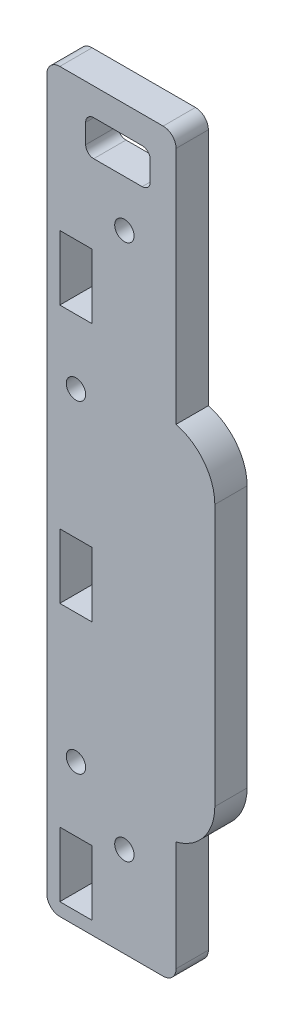
ISO-10303-21;
HEADER;
FILE_DESCRIPTION(('STEP AP214'),'2;1');
FILE_NAME('part.step','',(''),(''),'','','');
FILE_SCHEMA(('AUTOMOTIVE_DESIGN { 1 0 10303 214 1 1 1 1 }'));
ENDSEC;
DATA;
#1=APPLICATION_CONTEXT('core data for automotive mechanical design processes');
#2=APPLICATION_PROTOCOL_DEFINITION('international standard','automotive_design',2000,#1);
#3=PRODUCT_CONTEXT('',#1,'mechanical');
#4=PRODUCT('Part','Part','',(#3));
#5=PRODUCT_RELATED_PRODUCT_CATEGORY('part','',(#4));
#6=PRODUCT_DEFINITION_FORMATION('','',#4);
#7=PRODUCT_DEFINITION_CONTEXT('part definition',#1,'design');
#8=PRODUCT_DEFINITION('design','',#6,#7);
#9=PRODUCT_DEFINITION_SHAPE('','',#8);
#10=(LENGTH_UNIT() NAMED_UNIT(*) SI_UNIT(.MILLI.,.METRE.));
#11=(NAMED_UNIT(*) PLANE_ANGLE_UNIT() SI_UNIT($,.RADIAN.));
#12=(NAMED_UNIT(*) SI_UNIT($,.STERADIAN.) SOLID_ANGLE_UNIT());
#13=UNCERTAINTY_MEASURE_WITH_UNIT(LENGTH_MEASURE(1.E-05),#10,'distance_accuracy_value','');
#14=(GEOMETRIC_REPRESENTATION_CONTEXT(3) GLOBAL_UNCERTAINTY_ASSIGNED_CONTEXT((#13)) GLOBAL_UNIT_ASSIGNED_CONTEXT((#10,
#11,#12)) REPRESENTATION_CONTEXT('',''));
#15=CARTESIAN_POINT('',(0.,0.,0.));
#16=DIRECTION('',(0.,0.,1.));
#17=DIRECTION('',(1.,0.,0.));
#18=AXIS2_PLACEMENT_3D('',#15,#16,#17);
#19=CARTESIAN_POINT('',(5.25,103.5,5.));
#20=DIRECTION('',(0.,0.,-1.));
#21=DIRECTION('',(-1.,0.,0.));
#22=AXIS2_PLACEMENT_3D('',#19,#20,#21);
#23=CYLINDRICAL_SURFACE('',#22,1.25);
#24=CARTESIAN_POINT('',(5.25,103.5,5.));
#25=DIRECTION('',(0.,0.,1.));
#26=DIRECTION('',(1.,0.,0.));
#27=AXIS2_PLACEMENT_3D('',#24,#25,#26);
#28=CIRCLE('',#27,1.25);
#29=CARTESIAN_POINT('',(4.,103.5,5.));
#30=VERTEX_POINT('',#29);
#31=CARTESIAN_POINT('',(5.25,102.25,5.));
#32=VERTEX_POINT('',#31);
#33=EDGE_CURVE('E255',#30,#32,#28,.T.);
#34=ORIENTED_EDGE('',*,*,#33,.T.);
#35=DIRECTION('',(0.,0.,1.));
#36=VECTOR('',#35,1.);
#37=CARTESIAN_POINT('',(5.25,102.25,0.));
#38=LINE('',#37,#36);
#39=CARTESIAN_POINT('',(5.25,102.25,0.));
#40=VERTEX_POINT('',#39);
#41=EDGE_CURVE('E242',#40,#32,#38,.T.);
#42=ORIENTED_EDGE('',*,*,#41,.F.);
#43=CARTESIAN_POINT('',(5.25,103.5,0.));
#44=DIRECTION('',(0.,0.,1.));
#45=DIRECTION('',(1.,0.,0.));
#46=AXIS2_PLACEMENT_3D('',#43,#44,#45);
#47=CIRCLE('',#46,1.25);
#48=CARTESIAN_POINT('',(4.,103.5,0.));
#49=VERTEX_POINT('',#48);
#50=EDGE_CURVE('E252',#49,#40,#47,.T.);
#51=ORIENTED_EDGE('',*,*,#50,.F.);
#52=DIRECTION('',(0.,0.,-1.));
#53=VECTOR('',#52,1.);
#54=CARTESIAN_POINT('',(4.,103.5,5.));
#55=LINE('',#54,#53);
#56=EDGE_CURVE('E274',#30,#49,#55,.T.);
#57=ORIENTED_EDGE('',*,*,#56,.F.);
#58=EDGE_LOOP('',(#34,#42,#51,#57));
#59=FACE_BOUND('',#58,.T.);
#60=ADVANCED_FACE('F33',(#59),#23,.F.);
#61=CARTESIAN_POINT('',(0.,0.,5.));
#62=DIRECTION('',(0.,0.,-1.));
#63=DIRECTION('',(-1.,0.,0.));
#64=AXIS2_PLACEMENT_3D('',#61,#62,#63);
#65=PLANE('',#64);
#66=CARTESIAN_POINT('',(2.5,70.,5.));
#67=DIRECTION('',(0.,0.,1.));
#68=DIRECTION('',(1.,0.,0.));
#69=AXIS2_PLACEMENT_3D('',#66,#67,#68);
#70=CIRCLE('',#69,1.5);
#71=CARTESIAN_POINT('',(4.,70.,5.));
#72=VERTEX_POINT('',#71);
#73=EDGE_CURVE('E408',#72,#72,#70,.T.);
#74=ORIENTED_EDGE('',*,*,#73,.F.);
#75=EDGE_LOOP('',(#74));
#76=FACE_BOUND('',#75,.T.);
#77=CARTESIAN_POINT('',(2.5,20.,5.));
#78=DIRECTION('',(0.,0.,1.));
#79=DIRECTION('',(1.,0.,0.));
#80=AXIS2_PLACEMENT_3D('',#77,#78,#79);
#81=CIRCLE('',#80,1.5);
#82=CARTESIAN_POINT('',(4.,20.,5.));
#83=VERTEX_POINT('',#82);
#84=EDGE_CURVE('E416',#83,#83,#81,.T.);
#85=ORIENTED_EDGE('',*,*,#84,.F.);
#86=EDGE_LOOP('',(#85));
#87=FACE_BOUND('',#86,.T.);
#88=DIRECTION('',(1.,0.,0.));
#89=VECTOR('',#88,1.);
#90=CARTESIAN_POINT('',(0.,40.,5.));
#91=LINE('',#90,#89);
#92=CARTESIAN_POINT('',(0.,40.,5.));
#93=VERTEX_POINT('',#92);
#94=CARTESIAN_POINT('',(5.,40.,5.));
#95=VERTEX_POINT('',#94);
#96=EDGE_CURVE('E473',#93,#95,#91,.T.);
#97=ORIENTED_EDGE('',*,*,#96,.F.);
#98=DIRECTION('',(0.,-1.,0.));
#99=VECTOR('',#98,1.);
#100=CARTESIAN_POINT('',(0.,50.,5.));
#101=LINE('',#100,#99);
#102=CARTESIAN_POINT('',(0.,50.,5.));
#103=VERTEX_POINT('',#102);
#104=EDGE_CURVE('E415',#103,#93,#101,.T.);
#105=ORIENTED_EDGE('',*,*,#104,.F.);
#106=DIRECTION('',(-1.,0.,0.));
#107=VECTOR('',#106,1.);
#108=CARTESIAN_POINT('',(0.,50.,5.));
#109=LINE('',#108,#107);
#110=CARTESIAN_POINT('',(5.,50.,5.));
#111=VERTEX_POINT('',#110);
#112=EDGE_CURVE('E462',#111,#103,#109,.T.);
#113=ORIENTED_EDGE('',*,*,#112,.F.);
#114=DIRECTION('',(0.,1.,0.));
#115=VECTOR('',#114,1.);
#116=CARTESIAN_POINT('',(5.,50.,5.));
#117=LINE('',#116,#115);
#118=EDGE_CURVE('E476',#95,#111,#117,.T.);
#119=ORIENTED_EDGE('',*,*,#118,.F.);
#120=EDGE_LOOP('',(#97,#105,#113,#119));
#121=FACE_BOUND('',#120,.T.);
#122=DIRECTION('',(1.,0.,0.));
#123=VECTOR('',#122,1.);
#124=CARTESIAN_POINT('',(0.,80.,5.));
#125=LINE('',#124,#123);
#126=CARTESIAN_POINT('',(0.,80.,5.));
#127=VERTEX_POINT('',#126);
#128=CARTESIAN_POINT('',(5.,80.,5.));
#129=VERTEX_POINT('',#128);
#130=EDGE_CURVE('E440',#127,#129,#125,.T.);
#131=ORIENTED_EDGE('',*,*,#130,.F.);
#132=DIRECTION('',(0.,-1.,0.));
#133=VECTOR('',#132,1.);
#134=CARTESIAN_POINT('',(0.,80.,5.));
#135=LINE('',#134,#133);
#136=CARTESIAN_POINT('',(0.,90.,5.));
#137=VERTEX_POINT('',#136);
#138=EDGE_CURVE('E438',#137,#127,#135,.T.);
#139=ORIENTED_EDGE('',*,*,#138,.F.);
#140=DIRECTION('',(-1.,0.,0.));
#141=VECTOR('',#140,1.);
#142=CARTESIAN_POINT('',(0.,90.,5.));
#143=LINE('',#142,#141);
#144=CARTESIAN_POINT('',(5.,90.,5.));
#145=VERTEX_POINT('',#144);
#146=EDGE_CURVE('E428',#145,#137,#143,.T.);
#147=ORIENTED_EDGE('',*,*,#146,.F.);
#148=DIRECTION('',(0.,1.,0.));
#149=VECTOR('',#148,1.);
#150=CARTESIAN_POINT('',(5.,80.,5.));
#151=LINE('',#150,#149);
#152=EDGE_CURVE('E444',#129,#145,#151,.T.);
#153=ORIENTED_EDGE('',*,*,#152,.F.);
#154=EDGE_LOOP('',(#131,#139,#147,#153));
#155=FACE_BOUND('',#154,.T.);
#156=DIRECTION('',(1.,0.,0.));
#157=VECTOR('',#156,1.);
#158=CARTESIAN_POINT('',(0.,0.,5.));
#159=LINE('',#158,#157);
#160=CARTESIAN_POINT('',(0.,0.,5.));
#161=VERTEX_POINT('',#160);
#162=CARTESIAN_POINT('',(5.,0.,5.));
#163=VERTEX_POINT('',#162);
#164=EDGE_CURVE('E503',#161,#163,#159,.T.);
#165=ORIENTED_EDGE('',*,*,#164,.F.);
#166=DIRECTION('',(0.,-1.,0.));
#167=VECTOR('',#166,1.);
#168=CARTESIAN_POINT('',(0.,0.,5.));
#169=LINE('',#168,#167);
#170=CARTESIAN_POINT('',(0.,10.,5.));
#171=VERTEX_POINT('',#170);
#172=EDGE_CURVE('E451',#171,#161,#169,.T.);
#173=ORIENTED_EDGE('',*,*,#172,.F.);
#174=DIRECTION('',(-1.,0.,0.));
#175=VECTOR('',#174,1.);
#176=CARTESIAN_POINT('',(0.,10.,5.));
#177=LINE('',#176,#175);
#178=CARTESIAN_POINT('',(5.,10.,5.));
#179=VERTEX_POINT('',#178);
#180=EDGE_CURVE('E492',#179,#171,#177,.T.);
#181=ORIENTED_EDGE('',*,*,#180,.F.);
#182=DIRECTION('',(0.,1.,0.));
#183=VECTOR('',#182,1.);
#184=CARTESIAN_POINT('',(5.,0.,5.));
#185=LINE('',#184,#183);
#186=EDGE_CURVE('E506',#163,#179,#185,.T.);
#187=ORIENTED_EDGE('',*,*,#186,.F.);
#188=EDGE_LOOP('',(#165,#173,#181,#187));
#189=FACE_BOUND('',#188,.T.);
#190=DIRECTION('',(0.,-1.,0.));
#191=VECTOR('',#190,1.);
#192=CARTESIAN_POINT('',(18.,0.,5.));
#193=LINE('',#192,#191);
#194=CARTESIAN_POINT('',(18.,17.,5.));
#195=VERTEX_POINT('',#194);
#196=CARTESIAN_POINT('',(18.,0.,5.));
#197=VERTEX_POINT('',#196);
#198=EDGE_CURVE('E532',#195,#197,#193,.T.);
#199=ORIENTED_EDGE('',*,*,#198,.F.);
#200=CARTESIAN_POINT('',(16.,24.7459666924148,5.));
#201=DIRECTION('',(0.,0.,-1.));
#202=DIRECTION('',(-1.,0.,0.));
#203=AXIS2_PLACEMENT_3D('',#200,#201,#202);
#204=CIRCLE('',#203,8.);
#205=CARTESIAN_POINT('',(24.,24.7459666924148,5.));
#206=VERTEX_POINT('',#205);
#207=EDGE_CURVE('E335',#195,#206,#204,.F.);
#208=ORIENTED_EDGE('',*,*,#207,.T.);
#209=DIRECTION('',(0.,1.,0.));
#210=VECTOR('',#209,1.);
#211=CARTESIAN_POINT('',(24.,0.,5.));
#212=LINE('',#211,#210);
#213=CARTESIAN_POINT('',(24.,65.2540333075852,5.));
#214=VERTEX_POINT('',#213);
#215=EDGE_CURVE('E292',#206,#214,#212,.T.);
#216=ORIENTED_EDGE('',*,*,#215,.T.);
#217=CARTESIAN_POINT('',(16.,65.2540333075852,5.));
#218=DIRECTION('',(0.,0.,-1.));
#219=DIRECTION('',(-1.,0.,0.));
#220=AXIS2_PLACEMENT_3D('',#217,#218,#219);
#221=CIRCLE('',#220,8.);
#222=CARTESIAN_POINT('',(18.,73.,5.));
#223=VERTEX_POINT('',#222);
#224=EDGE_CURVE('E333',#214,#223,#221,.F.);
#225=ORIENTED_EDGE('',*,*,#224,.T.);
#226=DIRECTION('',(0.,-1.,0.));
#227=VECTOR('',#226,1.);
#228=CARTESIAN_POINT('',(18.,110.,5.));
#229=LINE('',#228,#227);
#230=CARTESIAN_POINT('',(18.,110.,5.));
#231=VERTEX_POINT('',#230);
#232=EDGE_CURVE('E363',#231,#223,#229,.T.);
#233=ORIENTED_EDGE('',*,*,#232,.F.);
#234=CARTESIAN_POINT('',(16.,110.,5.));
#235=DIRECTION('',(0.,0.,-1.));
#236=DIRECTION('',(-1.,0.,0.));
#237=AXIS2_PLACEMENT_3D('',#234,#235,#236);
#238=CIRCLE('',#237,2.);
#239=CARTESIAN_POINT('',(16.,112.,5.));
#240=VERTEX_POINT('',#239);
#241=EDGE_CURVE('E302',#231,#240,#238,.F.);
#242=ORIENTED_EDGE('',*,*,#241,.T.);
#243=DIRECTION('',(-1.,0.,0.));
#244=VECTOR('',#243,1.);
#245=CARTESIAN_POINT('',(18.,112.,5.));
#246=LINE('',#245,#244);
#247=CARTESIAN_POINT('',(0.,112.,5.));
#248=VERTEX_POINT('',#247);
#249=EDGE_CURVE('E513',#240,#248,#246,.T.);
#250=ORIENTED_EDGE('',*,*,#249,.T.);
#251=CARTESIAN_POINT('',(0.,110.,5.));
#252=DIRECTION('',(0.,0.,-1.));
#253=DIRECTION('',(-1.,0.,0.));
#254=AXIS2_PLACEMENT_3D('',#251,#252,#253);
#255=CIRCLE('',#254,2.);
#256=CARTESIAN_POINT('',(-2.,110.,5.));
#257=VERTEX_POINT('',#256);
#258=EDGE_CURVE('E304',#248,#257,#255,.F.);
#259=ORIENTED_EDGE('',*,*,#258,.T.);
#260=DIRECTION('',(0.,-1.,0.));
#261=VECTOR('',#260,1.);
#262=CARTESIAN_POINT('',(-2.,112.,5.));
#263=LINE('',#262,#261);
#264=CARTESIAN_POINT('',(-2.,0.,5.));
#265=VERTEX_POINT('',#264);
#266=EDGE_CURVE('E524',#257,#265,#263,.T.);
#267=ORIENTED_EDGE('',*,*,#266,.T.);
#268=CARTESIAN_POINT('',(0.,0.,5.));
#269=DIRECTION('',(0.,0.,-1.));
#270=DIRECTION('',(-1.,0.,0.));
#271=AXIS2_PLACEMENT_3D('',#268,#269,#270);
#272=CIRCLE('',#271,2.);
#273=CARTESIAN_POINT('',(0.,-2.,5.));
#274=VERTEX_POINT('',#273);
#275=EDGE_CURVE('E306',#265,#274,#272,.F.);
#276=ORIENTED_EDGE('',*,*,#275,.T.);
#277=DIRECTION('',(1.,0.,0.));
#278=VECTOR('',#277,1.);
#279=CARTESIAN_POINT('',(-2.,-2.,5.));
#280=LINE('',#279,#278);
#281=CARTESIAN_POINT('',(16.,-2.,5.));
#282=VERTEX_POINT('',#281);
#283=EDGE_CURVE('E520',#274,#282,#280,.T.);
#284=ORIENTED_EDGE('',*,*,#283,.T.);
#285=CARTESIAN_POINT('',(16.,0.,5.));
#286=DIRECTION('',(0.,0.,-1.));
#287=DIRECTION('',(-1.,0.,0.));
#288=AXIS2_PLACEMENT_3D('',#285,#286,#287);
#289=CIRCLE('',#288,2.);
#290=EDGE_CURVE('E308',#282,#197,#289,.F.);
#291=ORIENTED_EDGE('',*,*,#290,.T.);
#292=EDGE_LOOP('',(#199,#208,#216,#225,#233,#242,#250,#259,#267,#276,#284,#291));
#293=FACE_BOUND('',#292,.T.);
#294=CARTESIAN_POINT('',(10.,12.,5.));
#295=DIRECTION('',(0.,0.,1.));
#296=DIRECTION('',(1.,0.,0.));
#297=AXIS2_PLACEMENT_3D('',#294,#295,#296);
#298=CIRCLE('',#297,1.5);
#299=CARTESIAN_POINT('',(11.5,12.,5.));
#300=VERTEX_POINT('',#299);
#301=EDGE_CURVE('E286',#300,#300,#298,.T.);
#302=ORIENTED_EDGE('',*,*,#301,.F.);
#303=EDGE_LOOP('',(#302));
#304=FACE_BOUND('',#303,.T.);
#305=CARTESIAN_POINT('',(10.,95.,5.));
#306=DIRECTION('',(0.,0.,1.));
#307=DIRECTION('',(1.,0.,0.));
#308=AXIS2_PLACEMENT_3D('',#305,#306,#307);
#309=CIRCLE('',#308,1.5);
#310=CARTESIAN_POINT('',(11.5,95.,5.));
#311=VERTEX_POINT('',#310);
#312=EDGE_CURVE('E280',#311,#311,#309,.T.);
#313=ORIENTED_EDGE('',*,*,#312,.F.);
#314=EDGE_LOOP('',(#313));
#315=FACE_BOUND('',#314,.T.);
#316=CARTESIAN_POINT('',(5.25,106.5,5.));
#317=DIRECTION('',(0.,0.,1.));
#318=DIRECTION('',(1.,0.,0.));
#319=AXIS2_PLACEMENT_3D('',#316,#317,#318);
#320=CIRCLE('',#319,1.25);
#321=CARTESIAN_POINT('',(5.25,107.75,5.));
#322=VERTEX_POINT('',#321);
#323=CARTESIAN_POINT('',(4.,106.5,5.));
#324=VERTEX_POINT('',#323);
#325=EDGE_CURVE('E391',#322,#324,#320,.T.);
#326=ORIENTED_EDGE('',*,*,#325,.F.);
#327=DIRECTION('',(-1.,0.,0.));
#328=VECTOR('',#327,1.);
#329=CARTESIAN_POINT('',(5.25,107.75,5.));
#330=LINE('',#329,#328);
#331=CARTESIAN_POINT('',(12.75,107.75,5.));
#332=VERTEX_POINT('',#331);
#333=EDGE_CURVE('E247',#332,#322,#330,.T.);
#334=ORIENTED_EDGE('',*,*,#333,.F.);
#335=CARTESIAN_POINT('',(12.75,106.5,5.));
#336=DIRECTION('',(0.,0.,1.));
#337=DIRECTION('',(1.,0.,0.));
#338=AXIS2_PLACEMENT_3D('',#335,#336,#337);
#339=CIRCLE('',#338,1.25);
#340=CARTESIAN_POINT('',(14.,106.5,5.));
#341=VERTEX_POINT('',#340);
#342=EDGE_CURVE('E381',#341,#332,#339,.T.);
#343=ORIENTED_EDGE('',*,*,#342,.F.);
#344=DIRECTION('',(0.,1.,0.));
#345=VECTOR('',#344,1.);
#346=CARTESIAN_POINT('',(14.,103.5,5.));
#347=LINE('',#346,#345);
#348=CARTESIAN_POINT('',(14.,103.5,5.));
#349=VERTEX_POINT('',#348);
#350=EDGE_CURVE('E378',#349,#341,#347,.T.);
#351=ORIENTED_EDGE('',*,*,#350,.F.);
#352=CARTESIAN_POINT('',(12.75,103.5,5.));
#353=DIRECTION('',(0.,0.,1.));
#354=DIRECTION('',(1.,0.,0.));
#355=AXIS2_PLACEMENT_3D('',#352,#353,#354);
#356=CIRCLE('',#355,1.25);
#357=CARTESIAN_POINT('',(12.75,102.25,5.));
#358=VERTEX_POINT('',#357);
#359=EDGE_CURVE('E376',#358,#349,#356,.T.);
#360=ORIENTED_EDGE('',*,*,#359,.F.);
#361=DIRECTION('',(1.,0.,0.));
#362=VECTOR('',#361,1.);
#363=CARTESIAN_POINT('',(5.25,102.25,5.));
#364=LINE('',#363,#362);
#365=EDGE_CURVE('E48',#32,#358,#364,.T.);
#366=ORIENTED_EDGE('',*,*,#365,.F.);
#367=ORIENTED_EDGE('',*,*,#33,.F.);
#368=DIRECTION('',(0.,-1.,0.));
#369=VECTOR('',#368,1.);
#370=CARTESIAN_POINT('',(4.,103.5,5.));
#371=LINE('',#370,#369);
#372=EDGE_CURVE('E270',#324,#30,#371,.T.);
#373=ORIENTED_EDGE('',*,*,#372,.F.);
#374=EDGE_LOOP('',(#326,#334,#343,#351,#360,#366,#367,#373));
#375=FACE_BOUND('',#374,.T.);
#376=ADVANCED_FACE('F361',(#76,#87,#121,#155,#189,#293,#304,#315,#375),#65,.F.);
#377=CARTESIAN_POINT('',(0.,0.,0.));
#378=DIRECTION('',(0.,0.,-1.));
#379=DIRECTION('',(-1.,0.,0.));
#380=AXIS2_PLACEMENT_3D('',#377,#378,#379);
#381=PLANE('',#380);
#382=DIRECTION('',(-1.,0.,0.));
#383=VECTOR('',#382,1.);
#384=CARTESIAN_POINT('',(5.25,107.75,0.));
#385=LINE('',#384,#383);
#386=CARTESIAN_POINT('',(12.75,107.75,0.));
#387=VERTEX_POINT('',#386);
#388=CARTESIAN_POINT('',(5.25,107.75,0.));
#389=VERTEX_POINT('',#388);
#390=EDGE_CURVE('E56',#387,#389,#385,.T.);
#391=ORIENTED_EDGE('',*,*,#390,.T.);
#392=CARTESIAN_POINT('',(5.25,106.5,0.));
#393=DIRECTION('',(0.,0.,1.));
#394=DIRECTION('',(1.,0.,0.));
#395=AXIS2_PLACEMENT_3D('',#392,#393,#394);
#396=CIRCLE('',#395,1.25);
#397=CARTESIAN_POINT('',(4.,106.5,0.));
#398=VERTEX_POINT('',#397);
#399=EDGE_CURVE('E262',#389,#398,#396,.T.);
#400=ORIENTED_EDGE('',*,*,#399,.T.);
#401=DIRECTION('',(0.,-1.,0.));
#402=VECTOR('',#401,1.);
#403=CARTESIAN_POINT('',(4.,103.5,0.));
#404=LINE('',#403,#402);
#405=EDGE_CURVE('E261',#398,#49,#404,.T.);
#406=ORIENTED_EDGE('',*,*,#405,.T.);
#407=ORIENTED_EDGE('',*,*,#50,.T.);
#408=DIRECTION('',(1.,0.,0.));
#409=VECTOR('',#408,1.);
#410=CARTESIAN_POINT('',(5.25,102.25,0.));
#411=LINE('',#410,#409);
#412=CARTESIAN_POINT('',(12.75,102.25,0.));
#413=VERTEX_POINT('',#412);
#414=EDGE_CURVE('E239',#40,#413,#411,.T.);
#415=ORIENTED_EDGE('',*,*,#414,.T.);
#416=CARTESIAN_POINT('',(12.75,103.5,0.));
#417=DIRECTION('',(0.,0.,1.));
#418=DIRECTION('',(1.,0.,0.));
#419=AXIS2_PLACEMENT_3D('',#416,#417,#418);
#420=CIRCLE('',#419,1.25);
#421=CARTESIAN_POINT('',(14.,103.5,0.));
#422=VERTEX_POINT('',#421);
#423=EDGE_CURVE('E375',#413,#422,#420,.T.);
#424=ORIENTED_EDGE('',*,*,#423,.T.);
#425=DIRECTION('',(0.,1.,0.));
#426=VECTOR('',#425,1.);
#427=CARTESIAN_POINT('',(14.,103.5,0.));
#428=LINE('',#427,#426);
#429=CARTESIAN_POINT('',(14.,106.5,0.));
#430=VERTEX_POINT('',#429);
#431=EDGE_CURVE('E385',#422,#430,#428,.T.);
#432=ORIENTED_EDGE('',*,*,#431,.T.);
#433=CARTESIAN_POINT('',(12.75,106.5,0.));
#434=DIRECTION('',(0.,0.,1.));
#435=DIRECTION('',(1.,0.,0.));
#436=AXIS2_PLACEMENT_3D('',#433,#434,#435);
#437=CIRCLE('',#436,1.25);
#438=EDGE_CURVE('E379',#430,#387,#437,.T.);
#439=ORIENTED_EDGE('',*,*,#438,.T.);
#440=EDGE_LOOP('',(#391,#400,#406,#407,#415,#424,#432,#439));
#441=FACE_BOUND('',#440,.T.);
#442=CARTESIAN_POINT('',(2.5,70.,0.));
#443=DIRECTION('',(0.,0.,1.));
#444=DIRECTION('',(1.,0.,0.));
#445=AXIS2_PLACEMENT_3D('',#442,#443,#444);
#446=CIRCLE('',#445,1.5);
#447=CARTESIAN_POINT('',(4.,70.,0.));
#448=VERTEX_POINT('',#447);
#449=EDGE_CURVE('E419',#448,#448,#446,.T.);
#450=ORIENTED_EDGE('',*,*,#449,.T.);
#451=EDGE_LOOP('',(#450));
#452=FACE_BOUND('',#451,.T.);
#453=CARTESIAN_POINT('',(2.5,20.,0.));
#454=DIRECTION('',(0.,0.,1.));
#455=DIRECTION('',(1.,0.,0.));
#456=AXIS2_PLACEMENT_3D('',#453,#454,#455);
#457=CIRCLE('',#456,1.5);
#458=CARTESIAN_POINT('',(4.,20.,0.));
#459=VERTEX_POINT('',#458);
#460=EDGE_CURVE('E412',#459,#459,#457,.T.);
#461=ORIENTED_EDGE('',*,*,#460,.T.);
#462=EDGE_LOOP('',(#461));
#463=FACE_BOUND('',#462,.T.);
#464=DIRECTION('',(0.,-1.,0.));
#465=VECTOR('',#464,1.);
#466=CARTESIAN_POINT('',(0.,50.,0.));
#467=LINE('',#466,#465);
#468=CARTESIAN_POINT('',(0.,50.,0.));
#469=VERTEX_POINT('',#468);
#470=CARTESIAN_POINT('',(0.,40.,0.));
#471=VERTEX_POINT('',#470);
#472=EDGE_CURVE('E458',#469,#471,#467,.T.);
#473=ORIENTED_EDGE('',*,*,#472,.T.);
#474=DIRECTION('',(1.,0.,0.));
#475=VECTOR('',#474,1.);
#476=CARTESIAN_POINT('',(0.,40.,0.));
#477=LINE('',#476,#475);
#478=CARTESIAN_POINT('',(5.,40.,0.));
#479=VERTEX_POINT('',#478);
#480=EDGE_CURVE('E461',#471,#479,#477,.T.);
#481=ORIENTED_EDGE('',*,*,#480,.T.);
#482=DIRECTION('',(0.,1.,0.));
#483=VECTOR('',#482,1.);
#484=CARTESIAN_POINT('',(5.,50.,0.));
#485=LINE('',#484,#483);
#486=CARTESIAN_POINT('',(5.,50.,0.));
#487=VERTEX_POINT('',#486);
#488=EDGE_CURVE('E465',#479,#487,#485,.T.);
#489=ORIENTED_EDGE('',*,*,#488,.T.);
#490=DIRECTION('',(-1.,0.,0.));
#491=VECTOR('',#490,1.);
#492=CARTESIAN_POINT('',(0.,50.,0.));
#493=LINE('',#492,#491);
#494=EDGE_CURVE('E468',#487,#469,#493,.T.);
#495=ORIENTED_EDGE('',*,*,#494,.T.);
#496=EDGE_LOOP('',(#473,#481,#489,#495));
#497=FACE_BOUND('',#496,.T.);
#498=DIRECTION('',(0.,-1.,0.));
#499=VECTOR('',#498,1.);
#500=CARTESIAN_POINT('',(0.,80.,0.));
#501=LINE('',#500,#499);
#502=CARTESIAN_POINT('',(0.,90.,0.));
#503=VERTEX_POINT('',#502);
#504=CARTESIAN_POINT('',(0.,80.,0.));
#505=VERTEX_POINT('',#504);
#506=EDGE_CURVE('E424',#503,#505,#501,.T.);
#507=ORIENTED_EDGE('',*,*,#506,.T.);
#508=DIRECTION('',(1.,0.,0.));
#509=VECTOR('',#508,1.);
#510=CARTESIAN_POINT('',(0.,80.,0.));
#511=LINE('',#510,#509);
#512=CARTESIAN_POINT('',(5.,80.,0.));
#513=VERTEX_POINT('',#512);
#514=EDGE_CURVE('E427',#505,#513,#511,.T.);
#515=ORIENTED_EDGE('',*,*,#514,.T.);
#516=DIRECTION('',(0.,1.,0.));
#517=VECTOR('',#516,1.);
#518=CARTESIAN_POINT('',(5.,80.,0.));
#519=LINE('',#518,#517);
#520=CARTESIAN_POINT('',(5.,90.,0.));
#521=VERTEX_POINT('',#520);
#522=EDGE_CURVE('E431',#513,#521,#519,.T.);
#523=ORIENTED_EDGE('',*,*,#522,.T.);
#524=DIRECTION('',(-1.,0.,0.));
#525=VECTOR('',#524,1.);
#526=CARTESIAN_POINT('',(0.,90.,0.));
#527=LINE('',#526,#525);
#528=EDGE_CURVE('E434',#521,#503,#527,.T.);
#529=ORIENTED_EDGE('',*,*,#528,.T.);
#530=EDGE_LOOP('',(#507,#515,#523,#529));
#531=FACE_BOUND('',#530,.T.);
#532=DIRECTION('',(0.,-1.,0.));
#533=VECTOR('',#532,1.);
#534=CARTESIAN_POINT('',(0.,0.,0.));
#535=LINE('',#534,#533);
#536=CARTESIAN_POINT('',(0.,10.,0.));
#537=VERTEX_POINT('',#536);
#538=CARTESIAN_POINT('',(0.,0.,0.));
#539=VERTEX_POINT('',#538);
#540=EDGE_CURVE('E488',#537,#539,#535,.T.);
#541=ORIENTED_EDGE('',*,*,#540,.T.);
#542=DIRECTION('',(1.,0.,0.));
#543=VECTOR('',#542,1.);
#544=CARTESIAN_POINT('',(0.,0.,0.));
#545=LINE('',#544,#543);
#546=CARTESIAN_POINT('',(5.,0.,0.));
#547=VERTEX_POINT('',#546);
#548=EDGE_CURVE('E491',#539,#547,#545,.T.);
#549=ORIENTED_EDGE('',*,*,#548,.T.);
#550=DIRECTION('',(0.,1.,0.));
#551=VECTOR('',#550,1.);
#552=CARTESIAN_POINT('',(5.,0.,0.));
#553=LINE('',#552,#551);
#554=CARTESIAN_POINT('',(5.,10.,0.));
#555=VERTEX_POINT('',#554);
#556=EDGE_CURVE('E495',#547,#555,#553,.T.);
#557=ORIENTED_EDGE('',*,*,#556,.T.);
#558=DIRECTION('',(-1.,0.,0.));
#559=VECTOR('',#558,1.);
#560=CARTESIAN_POINT('',(0.,10.,0.));
#561=LINE('',#560,#559);
#562=EDGE_CURVE('E498',#555,#537,#561,.T.);
#563=ORIENTED_EDGE('',*,*,#562,.T.);
#564=EDGE_LOOP('',(#541,#549,#557,#563));
#565=FACE_BOUND('',#564,.T.);
#566=DIRECTION('',(0.,1.,0.));
#567=VECTOR('',#566,1.);
#568=CARTESIAN_POINT('',(24.,0.,0.));
#569=LINE('',#568,#567);
#570=CARTESIAN_POINT('',(24.,24.7459666924148,0.));
#571=VERTEX_POINT('',#570);
#572=CARTESIAN_POINT('',(24.,65.2540333075852,0.));
#573=VERTEX_POINT('',#572);
#574=EDGE_CURVE('E289',#571,#573,#569,.T.);
#575=ORIENTED_EDGE('',*,*,#574,.F.);
#576=CARTESIAN_POINT('',(16.,24.7459666924148,0.));
#577=DIRECTION('',(0.,0.,-1.));
#578=DIRECTION('',(-1.,0.,0.));
#579=AXIS2_PLACEMENT_3D('',#576,#577,#578);
#580=CIRCLE('',#579,8.);
#581=CARTESIAN_POINT('',(18.,17.,0.));
#582=VERTEX_POINT('',#581);
#583=EDGE_CURVE('E11',#571,#582,#580,.T.);
#584=ORIENTED_EDGE('',*,*,#583,.T.);
#585=DIRECTION('',(0.,-1.,0.));
#586=VECTOR('',#585,1.);
#587=CARTESIAN_POINT('',(18.,0.,0.));
#588=LINE('',#587,#586);
#589=CARTESIAN_POINT('',(18.,0.,0.));
#590=VERTEX_POINT('',#589);
#591=EDGE_CURVE('E371',#582,#590,#588,.T.);
#592=ORIENTED_EDGE('',*,*,#591,.T.);
#593=CARTESIAN_POINT('',(16.,0.,0.));
#594=DIRECTION('',(0.,0.,-1.));
#595=DIRECTION('',(-1.,0.,0.));
#596=AXIS2_PLACEMENT_3D('',#593,#594,#595);
#597=CIRCLE('',#596,2.);
#598=CARTESIAN_POINT('',(16.,-2.,0.));
#599=VERTEX_POINT('',#598);
#600=EDGE_CURVE('E318',#590,#599,#597,.T.);
#601=ORIENTED_EDGE('',*,*,#600,.T.);
#602=DIRECTION('',(1.,0.,0.));
#603=VECTOR('',#602,1.);
#604=CARTESIAN_POINT('',(-2.,-2.,0.));
#605=LINE('',#604,#603);
#606=CARTESIAN_POINT('',(0.,-2.,0.));
#607=VERTEX_POINT('',#606);
#608=EDGE_CURVE('E529',#607,#599,#605,.T.);
#609=ORIENTED_EDGE('',*,*,#608,.F.);
#610=CARTESIAN_POINT('',(0.,0.,0.));
#611=DIRECTION('',(0.,0.,-1.));
#612=DIRECTION('',(-1.,0.,0.));
#613=AXIS2_PLACEMENT_3D('',#610,#611,#612);
#614=CIRCLE('',#613,2.);
#615=CARTESIAN_POINT('',(-2.,0.,0.));
#616=VERTEX_POINT('',#615);
#617=EDGE_CURVE('E316',#607,#616,#614,.T.);
#618=ORIENTED_EDGE('',*,*,#617,.T.);
#619=DIRECTION('',(0.,-1.,0.));
#620=VECTOR('',#619,1.);
#621=CARTESIAN_POINT('',(-2.,112.,0.));
#622=LINE('',#621,#620);
#623=CARTESIAN_POINT('',(-2.,110.,0.));
#624=VERTEX_POINT('',#623);
#625=EDGE_CURVE('E533',#624,#616,#622,.T.);
#626=ORIENTED_EDGE('',*,*,#625,.F.);
#627=CARTESIAN_POINT('',(0.,110.,0.));
#628=DIRECTION('',(0.,0.,-1.));
#629=DIRECTION('',(-1.,0.,0.));
#630=AXIS2_PLACEMENT_3D('',#627,#628,#629);
#631=CIRCLE('',#630,2.);
#632=CARTESIAN_POINT('',(0.,112.,0.));
#633=VERTEX_POINT('',#632);
#634=EDGE_CURVE('E314',#624,#633,#631,.T.);
#635=ORIENTED_EDGE('',*,*,#634,.T.);
#636=DIRECTION('',(-1.,0.,0.));
#637=VECTOR('',#636,1.);
#638=CARTESIAN_POINT('',(18.,112.,0.));
#639=LINE('',#638,#637);
#640=CARTESIAN_POINT('',(16.,112.,0.));
#641=VERTEX_POINT('',#640);
#642=EDGE_CURVE('E523',#641,#633,#639,.T.);
#643=ORIENTED_EDGE('',*,*,#642,.F.);
#644=CARTESIAN_POINT('',(16.,110.,0.));
#645=DIRECTION('',(0.,0.,-1.));
#646=DIRECTION('',(-1.,0.,0.));
#647=AXIS2_PLACEMENT_3D('',#644,#645,#646);
#648=CIRCLE('',#647,2.);
#649=CARTESIAN_POINT('',(18.,110.,0.));
#650=VERTEX_POINT('',#649);
#651=EDGE_CURVE('E312',#641,#650,#648,.T.);
#652=ORIENTED_EDGE('',*,*,#651,.T.);
#653=DIRECTION('',(0.,-1.,0.));
#654=VECTOR('',#653,1.);
#655=CARTESIAN_POINT('',(18.,110.,0.));
#656=LINE('',#655,#654);
#657=CARTESIAN_POINT('',(18.,73.,0.));
#658=VERTEX_POINT('',#657);
#659=EDGE_CURVE('E347',#650,#658,#656,.T.);
#660=ORIENTED_EDGE('',*,*,#659,.T.);
#661=CARTESIAN_POINT('',(16.,65.2540333075852,0.));
#662=DIRECTION('',(0.,0.,-1.));
#663=DIRECTION('',(-1.,0.,0.));
#664=AXIS2_PLACEMENT_3D('',#661,#662,#663);
#665=CIRCLE('',#664,8.);
#666=EDGE_CURVE('E41',#658,#573,#665,.T.);
#667=ORIENTED_EDGE('',*,*,#666,.T.);
#668=EDGE_LOOP('',(#575,#584,#592,#601,#609,#618,#626,#635,#643,#652,#660,#667));
#669=FACE_BOUND('',#668,.T.);
#670=CARTESIAN_POINT('',(10.,12.,0.));
#671=DIRECTION('',(0.,0.,1.));
#672=DIRECTION('',(1.,0.,0.));
#673=AXIS2_PLACEMENT_3D('',#670,#671,#672);
#674=CIRCLE('',#673,1.5);
#675=CARTESIAN_POINT('',(11.5,12.,0.));
#676=VERTEX_POINT('',#675);
#677=EDGE_CURVE('E283',#676,#676,#674,.T.);
#678=ORIENTED_EDGE('',*,*,#677,.T.);
#679=EDGE_LOOP('',(#678));
#680=FACE_BOUND('',#679,.T.);
#681=CARTESIAN_POINT('',(10.,95.,0.));
#682=DIRECTION('',(0.,0.,1.));
#683=DIRECTION('',(1.,0.,0.));
#684=AXIS2_PLACEMENT_3D('',#681,#682,#683);
#685=CIRCLE('',#684,1.5);
#686=CARTESIAN_POINT('',(11.5,95.,0.));
#687=VERTEX_POINT('',#686);
#688=EDGE_CURVE('E279',#687,#687,#685,.T.);
#689=ORIENTED_EDGE('',*,*,#688,.T.);
#690=EDGE_LOOP('',(#689));
#691=FACE_BOUND('',#690,.T.);
#692=ADVANCED_FACE('F258',(#441,#452,#463,#497,#531,#565,#669,#680,#691),#381,.T.);
#693=CARTESIAN_POINT('',(24.,0.,5.));
#694=DIRECTION('',(-1.,0.,0.));
#695=DIRECTION('',(0.,0.,1.));
#696=AXIS2_PLACEMENT_3D('',#693,#694,#695);
#697=PLANE('',#696);
#698=ORIENTED_EDGE('',*,*,#215,.F.);
#699=DIRECTION('',(0.,0.,1.));
#700=VECTOR('',#699,1.);
#701=CARTESIAN_POINT('',(24.,24.7459666924148,5.));
#702=LINE('',#701,#700);
#703=EDGE_CURVE('E340',#206,#571,#702,.F.);
#704=ORIENTED_EDGE('',*,*,#703,.T.);
#705=ORIENTED_EDGE('',*,*,#574,.T.);
#706=DIRECTION('',(0.,0.,-1.));
#707=VECTOR('',#706,1.);
#708=CARTESIAN_POINT('',(24.,65.2540333075852,5.));
#709=LINE('',#708,#707);
#710=EDGE_CURVE('E337',#573,#214,#709,.F.);
#711=ORIENTED_EDGE('',*,*,#710,.T.);
#712=EDGE_LOOP('',(#698,#704,#705,#711));
#713=FACE_BOUND('',#712,.T.);
#714=ADVANCED_FACE('F354',(#713),#697,.F.);
#715=CARTESIAN_POINT('',(10.,12.,5.));
#716=DIRECTION('',(0.,0.,-1.));
#717=DIRECTION('',(-1.,0.,0.));
#718=AXIS2_PLACEMENT_3D('',#715,#716,#717);
#719=CYLINDRICAL_SURFACE('',#718,1.5);
#720=ORIENTED_EDGE('',*,*,#301,.T.);
#721=EDGE_LOOP('',(#720));
#722=FACE_BOUND('',#721,.T.);
#723=ORIENTED_EDGE('',*,*,#677,.F.);
#724=EDGE_LOOP('',(#723));
#725=FACE_BOUND('',#724,.T.);
#726=ADVANCED_FACE('F599',(#722,#725),#719,.F.);
#727=CARTESIAN_POINT('',(10.,95.,5.));
#728=DIRECTION('',(0.,0.,-1.));
#729=DIRECTION('',(-1.,0.,0.));
#730=AXIS2_PLACEMENT_3D('',#727,#728,#729);
#731=CYLINDRICAL_SURFACE('',#730,1.5);
#732=ORIENTED_EDGE('',*,*,#312,.T.);
#733=EDGE_LOOP('',(#732));
#734=FACE_BOUND('',#733,.T.);
#735=ORIENTED_EDGE('',*,*,#688,.F.);
#736=EDGE_LOOP('',(#735));
#737=FACE_BOUND('',#736,.T.);
#738=ADVANCED_FACE('F596',(#734,#737),#731,.F.);
#739=CARTESIAN_POINT('',(5.25,106.5,5.));
#740=DIRECTION('',(0.,0.,-1.));
#741=DIRECTION('',(-1.,0.,0.));
#742=AXIS2_PLACEMENT_3D('',#739,#740,#741);
#743=CYLINDRICAL_SURFACE('',#742,1.25);
#744=DIRECTION('',(0.,0.,1.));
#745=VECTOR('',#744,1.);
#746=CARTESIAN_POINT('',(5.25,107.75,0.));
#747=LINE('',#746,#745);
#748=EDGE_CURVE('E406',#389,#322,#747,.T.);
#749=ORIENTED_EDGE('',*,*,#748,.T.);
#750=ORIENTED_EDGE('',*,*,#325,.T.);
#751=DIRECTION('',(0.,0.,-1.));
#752=VECTOR('',#751,1.);
#753=CARTESIAN_POINT('',(4.,106.5,5.));
#754=LINE('',#753,#752);
#755=EDGE_CURVE('E276',#324,#398,#754,.T.);
#756=ORIENTED_EDGE('',*,*,#755,.T.);
#757=ORIENTED_EDGE('',*,*,#399,.F.);
#758=EDGE_LOOP('',(#749,#750,#756,#757));
#759=FACE_BOUND('',#758,.T.);
#760=ADVANCED_FACE('F594',(#759),#743,.F.);
#761=CARTESIAN_POINT('',(4.,103.5,5.));
#762=DIRECTION('',(1.,0.,0.));
#763=DIRECTION('',(0.,0.,-1.));
#764=AXIS2_PLACEMENT_3D('',#761,#762,#763);
#765=PLANE('',#764);
#766=ORIENTED_EDGE('',*,*,#405,.F.);
#767=ORIENTED_EDGE('',*,*,#755,.F.);
#768=ORIENTED_EDGE('',*,*,#372,.T.);
#769=ORIENTED_EDGE('',*,*,#56,.T.);
#770=EDGE_LOOP('',(#766,#767,#768,#769));
#771=FACE_BOUND('',#770,.T.);
#772=ADVANCED_FACE('F398',(#771),#765,.T.);
#773=CARTESIAN_POINT('',(12.75,103.5,5.));
#774=DIRECTION('',(0.,0.,-1.));
#775=DIRECTION('',(-1.,0.,0.));
#776=AXIS2_PLACEMENT_3D('',#773,#774,#775);
#777=CYLINDRICAL_SURFACE('',#776,1.25);
#778=DIRECTION('',(0.,0.,1.));
#779=VECTOR('',#778,1.);
#780=CARTESIAN_POINT('',(12.75,102.25,0.));
#781=LINE('',#780,#779);
#782=EDGE_CURVE('E243',#413,#358,#781,.T.);
#783=ORIENTED_EDGE('',*,*,#782,.T.);
#784=ORIENTED_EDGE('',*,*,#359,.T.);
#785=DIRECTION('',(0.,0.,-1.));
#786=VECTOR('',#785,1.);
#787=CARTESIAN_POINT('',(14.,103.5,5.));
#788=LINE('',#787,#786);
#789=EDGE_CURVE('E263',#349,#422,#788,.T.);
#790=ORIENTED_EDGE('',*,*,#789,.T.);
#791=ORIENTED_EDGE('',*,*,#423,.F.);
#792=EDGE_LOOP('',(#783,#784,#790,#791));
#793=FACE_BOUND('',#792,.T.);
#794=ADVANCED_FACE('F703',(#793),#777,.F.);
#795=CARTESIAN_POINT('',(14.,103.5,5.));
#796=DIRECTION('',(-1.,0.,0.));
#797=DIRECTION('',(0.,0.,1.));
#798=AXIS2_PLACEMENT_3D('',#795,#796,#797);
#799=PLANE('',#798);
#800=ORIENTED_EDGE('',*,*,#431,.F.);
#801=ORIENTED_EDGE('',*,*,#789,.F.);
#802=ORIENTED_EDGE('',*,*,#350,.T.);
#803=DIRECTION('',(0.,0.,-1.));
#804=VECTOR('',#803,1.);
#805=CARTESIAN_POINT('',(14.,106.5,5.));
#806=LINE('',#805,#804);
#807=EDGE_CURVE('E267',#341,#430,#806,.T.);
#808=ORIENTED_EDGE('',*,*,#807,.T.);
#809=EDGE_LOOP('',(#800,#801,#802,#808));
#810=FACE_BOUND('',#809,.T.);
#811=ADVANCED_FACE('F708',(#810),#799,.T.);
#812=CARTESIAN_POINT('',(12.75,106.5,5.));
#813=DIRECTION('',(0.,0.,-1.));
#814=DIRECTION('',(-1.,0.,0.));
#815=AXIS2_PLACEMENT_3D('',#812,#813,#814);
#816=CYLINDRICAL_SURFACE('',#815,1.25);
#817=DIRECTION('',(0.,0.,1.));
#818=VECTOR('',#817,1.);
#819=CARTESIAN_POINT('',(12.75,107.75,0.));
#820=LINE('',#819,#818);
#821=EDGE_CURVE('E409',#387,#332,#820,.T.);
#822=ORIENTED_EDGE('',*,*,#821,.F.);
#823=ORIENTED_EDGE('',*,*,#438,.F.);
#824=ORIENTED_EDGE('',*,*,#807,.F.);
#825=ORIENTED_EDGE('',*,*,#342,.T.);
#826=EDGE_LOOP('',(#822,#823,#824,#825));
#827=FACE_BOUND('',#826,.T.);
#828=ADVANCED_FACE('F643',(#827),#816,.F.);
#829=CARTESIAN_POINT('',(18.,110.,0.));
#830=DIRECTION('',(-1.,0.,0.));
#831=DIRECTION('',(0.,-1.,0.));
#832=AXIS2_PLACEMENT_3D('',#829,#830,#831);
#833=PLANE('',#832);
#834=ORIENTED_EDGE('',*,*,#659,.F.);
#835=DIRECTION('',(0.,0.,1.));
#836=VECTOR('',#835,1.);
#837=CARTESIAN_POINT('',(18.,110.,5.));
#838=LINE('',#837,#836);
#839=EDGE_CURVE('E330',#650,#231,#838,.T.);
#840=ORIENTED_EDGE('',*,*,#839,.T.);
#841=ORIENTED_EDGE('',*,*,#232,.T.);
#842=DIRECTION('',(0.,0.,1.));
#843=VECTOR('',#842,1.);
#844=CARTESIAN_POINT('',(18.,73.,0.));
#845=LINE('',#844,#843);
#846=EDGE_CURVE('E356',#658,#223,#845,.T.);
#847=ORIENTED_EDGE('',*,*,#846,.F.);
#848=EDGE_LOOP('',(#834,#840,#841,#847));
#849=FACE_BOUND('',#848,.T.);
#850=ADVANCED_FACE('F365',(#849),#833,.F.);
#851=CARTESIAN_POINT('',(18.,0.,0.));
#852=DIRECTION('',(-1.,0.,0.));
#853=DIRECTION('',(0.,0.,1.));
#854=AXIS2_PLACEMENT_3D('',#851,#852,#853);
#855=PLANE('',#854);
#856=ORIENTED_EDGE('',*,*,#198,.T.);
#857=DIRECTION('',(0.,0.,1.));
#858=VECTOR('',#857,1.);
#859=CARTESIAN_POINT('',(18.,0.,0.));
#860=LINE('',#859,#858);
#861=EDGE_CURVE('E310',#197,#590,#860,.F.);
#862=ORIENTED_EDGE('',*,*,#861,.T.);
#863=ORIENTED_EDGE('',*,*,#591,.F.);
#864=DIRECTION('',(0.,0.,1.));
#865=VECTOR('',#864,1.);
#866=CARTESIAN_POINT('',(18.,17.,0.));
#867=LINE('',#866,#865);
#868=EDGE_CURVE('E367',#582,#195,#867,.T.);
#869=ORIENTED_EDGE('',*,*,#868,.T.);
#870=EDGE_LOOP('',(#856,#862,#863,#869));
#871=FACE_BOUND('',#870,.T.);
#872=ADVANCED_FACE('F543',(#871),#855,.F.);
#873=CARTESIAN_POINT('',(18.,112.,-115.741090369842));
#874=DIRECTION('',(0.,1.,0.));
#875=DIRECTION('',(0.,0.,1.));
#876=AXIS2_PLACEMENT_3D('',#873,#874,#875);
#877=PLANE('',#876);
#878=ORIENTED_EDGE('',*,*,#642,.T.);
#879=DIRECTION('',(0.,0.,1.));
#880=VECTOR('',#879,1.);
#881=CARTESIAN_POINT('',(0.,112.,-115.741090369842));
#882=LINE('',#881,#880);
#883=EDGE_CURVE('E327',#633,#248,#882,.T.);
#884=ORIENTED_EDGE('',*,*,#883,.T.);
#885=ORIENTED_EDGE('',*,*,#249,.F.);
#886=DIRECTION('',(0.,0.,1.));
#887=VECTOR('',#886,1.);
#888=CARTESIAN_POINT('',(16.,112.,0.));
#889=LINE('',#888,#887);
#890=EDGE_CURVE('E325',#240,#641,#889,.F.);
#891=ORIENTED_EDGE('',*,*,#890,.T.);
#892=EDGE_LOOP('',(#878,#884,#885,#891));
#893=FACE_BOUND('',#892,.T.);
#894=ADVANCED_FACE('F571',(#893),#877,.T.);
#895=CARTESIAN_POINT('',(-2.,112.,-115.741090369842));
#896=DIRECTION('',(-1.,0.,0.));
#897=DIRECTION('',(0.,-1.,0.));
#898=AXIS2_PLACEMENT_3D('',#895,#896,#897);
#899=PLANE('',#898);
#900=ORIENTED_EDGE('',*,*,#625,.T.);
#901=DIRECTION('',(0.,0.,1.));
#902=VECTOR('',#901,1.);
#903=CARTESIAN_POINT('',(-2.,0.,-115.741090369842));
#904=LINE('',#903,#902);
#905=EDGE_CURVE('E322',#616,#265,#904,.T.);
#906=ORIENTED_EDGE('',*,*,#905,.T.);
#907=ORIENTED_EDGE('',*,*,#266,.F.);
#908=DIRECTION('',(0.,0.,1.));
#909=VECTOR('',#908,1.);
#910=CARTESIAN_POINT('',(-2.,110.,-115.741090369842));
#911=LINE('',#910,#909);
#912=EDGE_CURVE('E320',#257,#624,#911,.F.);
#913=ORIENTED_EDGE('',*,*,#912,.T.);
#914=EDGE_LOOP('',(#900,#906,#907,#913));
#915=FACE_BOUND('',#914,.T.);
#916=ADVANCED_FACE('F562',(#915),#899,.T.);
#917=CARTESIAN_POINT('',(-2.,-2.,-115.741090369842));
#918=DIRECTION('',(0.,-1.,0.));
#919=DIRECTION('',(0.,0.,-1.));
#920=AXIS2_PLACEMENT_3D('',#917,#918,#919);
#921=PLANE('',#920);
#922=ORIENTED_EDGE('',*,*,#608,.T.);
#923=DIRECTION('',(0.,0.,1.));
#924=VECTOR('',#923,1.);
#925=CARTESIAN_POINT('',(16.,-2.,5.));
#926=LINE('',#925,#924);
#927=EDGE_CURVE('E299',#599,#282,#926,.T.);
#928=ORIENTED_EDGE('',*,*,#927,.T.);
#929=ORIENTED_EDGE('',*,*,#283,.F.);
#930=DIRECTION('',(0.,0.,1.));
#931=VECTOR('',#930,1.);
#932=CARTESIAN_POINT('',(0.,-2.,-115.741090369842));
#933=LINE('',#932,#931);
#934=EDGE_CURVE('E295',#274,#607,#933,.F.);
#935=ORIENTED_EDGE('',*,*,#934,.T.);
#936=EDGE_LOOP('',(#922,#928,#929,#935));
#937=FACE_BOUND('',#936,.T.);
#938=ADVANCED_FACE('F553',(#937),#921,.T.);
#939=CARTESIAN_POINT('',(0.,0.,0.));
#940=DIRECTION('',(-1.,0.,0.));
#941=DIRECTION('',(0.,0.,1.));
#942=AXIS2_PLACEMENT_3D('',#939,#940,#941);
#943=PLANE('',#942);
#944=ORIENTED_EDGE('',*,*,#172,.T.);
#945=DIRECTION('',(0.,0.,1.));
#946=VECTOR('',#945,1.);
#947=CARTESIAN_POINT('',(0.,0.,0.));
#948=LINE('',#947,#946);
#949=EDGE_CURVE('E501',#539,#161,#948,.T.);
#950=ORIENTED_EDGE('',*,*,#949,.F.);
#951=ORIENTED_EDGE('',*,*,#540,.F.);
#952=DIRECTION('',(0.,0.,1.));
#953=VECTOR('',#952,1.);
#954=CARTESIAN_POINT('',(0.,10.,0.));
#955=LINE('',#954,#953);
#956=EDGE_CURVE('E511',#537,#171,#955,.T.);
#957=ORIENTED_EDGE('',*,*,#956,.T.);
#958=EDGE_LOOP('',(#944,#950,#951,#957));
#959=FACE_BOUND('',#958,.T.);
#960=ADVANCED_FACE('F781',(#959),#943,.F.);
#961=CARTESIAN_POINT('',(0.,10.,0.));
#962=DIRECTION('',(0.,1.,0.));
#963=DIRECTION('',(0.,0.,1.));
#964=AXIS2_PLACEMENT_3D('',#961,#962,#963);
#965=PLANE('',#964);
#966=ORIENTED_EDGE('',*,*,#180,.T.);
#967=ORIENTED_EDGE('',*,*,#956,.F.);
#968=ORIENTED_EDGE('',*,*,#562,.F.);
#969=DIRECTION('',(0.,0.,1.));
#970=VECTOR('',#969,1.);
#971=CARTESIAN_POINT('',(5.,10.,0.));
#972=LINE('',#971,#970);
#973=EDGE_CURVE('E514',#555,#179,#972,.T.);
#974=ORIENTED_EDGE('',*,*,#973,.T.);
#975=EDGE_LOOP('',(#966,#967,#968,#974));
#976=FACE_BOUND('',#975,.T.);
#977=ADVANCED_FACE('F777',(#976),#965,.F.);
#978=CARTESIAN_POINT('',(5.,0.,0.));
#979=DIRECTION('',(1.,0.,0.));
#980=DIRECTION('',(0.,0.,-1.));
#981=AXIS2_PLACEMENT_3D('',#978,#979,#980);
#982=PLANE('',#981);
#983=ORIENTED_EDGE('',*,*,#186,.T.);
#984=ORIENTED_EDGE('',*,*,#973,.F.);
#985=ORIENTED_EDGE('',*,*,#556,.F.);
#986=DIRECTION('',(0.,0.,1.));
#987=VECTOR('',#986,1.);
#988=CARTESIAN_POINT('',(5.,0.,0.));
#989=LINE('',#988,#987);
#990=EDGE_CURVE('E516',#547,#163,#989,.T.);
#991=ORIENTED_EDGE('',*,*,#990,.T.);
#992=EDGE_LOOP('',(#983,#984,#985,#991));
#993=FACE_BOUND('',#992,.T.);
#994=ADVANCED_FACE('F780',(#993),#982,.F.);
#995=CARTESIAN_POINT('',(0.,0.,0.));
#996=DIRECTION('',(0.,-1.,0.));
#997=DIRECTION('',(0.,0.,-1.));
#998=AXIS2_PLACEMENT_3D('',#995,#996,#997);
#999=PLANE('',#998);
#1000=ORIENTED_EDGE('',*,*,#164,.T.);
#1001=ORIENTED_EDGE('',*,*,#990,.F.);
#1002=ORIENTED_EDGE('',*,*,#548,.F.);
#1003=ORIENTED_EDGE('',*,*,#949,.T.);
#1004=EDGE_LOOP('',(#1000,#1001,#1002,#1003));
#1005=FACE_BOUND('',#1004,.T.);
#1006=ADVANCED_FACE('F761',(#1005),#999,.F.);
#1007=CARTESIAN_POINT('',(0.,80.,0.));
#1008=DIRECTION('',(-1.,0.,0.));
#1009=DIRECTION('',(0.,0.,1.));
#1010=AXIS2_PLACEMENT_3D('',#1007,#1008,#1009);
#1011=PLANE('',#1010);
#1012=ORIENTED_EDGE('',*,*,#138,.T.);
#1013=DIRECTION('',(0.,0.,1.));
#1014=VECTOR('',#1013,1.);
#1015=CARTESIAN_POINT('',(0.,80.,0.));
#1016=LINE('',#1015,#1014);
#1017=EDGE_CURVE('E437',#505,#127,#1016,.T.);
#1018=ORIENTED_EDGE('',*,*,#1017,.F.);
#1019=ORIENTED_EDGE('',*,*,#506,.F.);
#1020=DIRECTION('',(0.,0.,1.));
#1021=VECTOR('',#1020,1.);
#1022=CARTESIAN_POINT('',(0.,90.,0.));
#1023=LINE('',#1022,#1021);
#1024=EDGE_CURVE('E449',#503,#137,#1023,.T.);
#1025=ORIENTED_EDGE('',*,*,#1024,.T.);
#1026=EDGE_LOOP('',(#1012,#1018,#1019,#1025));
#1027=FACE_BOUND('',#1026,.T.);
#1028=ADVANCED_FACE('F749',(#1027),#1011,.F.);
#1029=CARTESIAN_POINT('',(0.,90.,0.));
#1030=DIRECTION('',(0.,1.,0.));
#1031=DIRECTION('',(0.,0.,1.));
#1032=AXIS2_PLACEMENT_3D('',#1029,#1030,#1031);
#1033=PLANE('',#1032);
#1034=ORIENTED_EDGE('',*,*,#146,.T.);
#1035=ORIENTED_EDGE('',*,*,#1024,.F.);
#1036=ORIENTED_EDGE('',*,*,#528,.F.);
#1037=DIRECTION('',(0.,0.,1.));
#1038=VECTOR('',#1037,1.);
#1039=CARTESIAN_POINT('',(5.,90.,0.));
#1040=LINE('',#1039,#1038);
#1041=EDGE_CURVE('E452',#521,#145,#1040,.T.);
#1042=ORIENTED_EDGE('',*,*,#1041,.T.);
#1043=EDGE_LOOP('',(#1034,#1035,#1036,#1042));
#1044=FACE_BOUND('',#1043,.T.);
#1045=ADVANCED_FACE('F745',(#1044),#1033,.F.);
#1046=CARTESIAN_POINT('',(5.,80.,0.));
#1047=DIRECTION('',(1.,0.,0.));
#1048=DIRECTION('',(0.,0.,-1.));
#1049=AXIS2_PLACEMENT_3D('',#1046,#1047,#1048);
#1050=PLANE('',#1049);
#1051=ORIENTED_EDGE('',*,*,#152,.T.);
#1052=ORIENTED_EDGE('',*,*,#1041,.F.);
#1053=ORIENTED_EDGE('',*,*,#522,.F.);
#1054=DIRECTION('',(0.,0.,1.));
#1055=VECTOR('',#1054,1.);
#1056=CARTESIAN_POINT('',(5.,80.,0.));
#1057=LINE('',#1056,#1055);
#1058=EDGE_CURVE('E454',#513,#129,#1057,.T.);
#1059=ORIENTED_EDGE('',*,*,#1058,.T.);
#1060=EDGE_LOOP('',(#1051,#1052,#1053,#1059));
#1061=FACE_BOUND('',#1060,.T.);
#1062=ADVANCED_FACE('F748',(#1061),#1050,.F.);
#1063=CARTESIAN_POINT('',(0.,80.,0.));
#1064=DIRECTION('',(0.,-1.,0.));
#1065=DIRECTION('',(0.,0.,-1.));
#1066=AXIS2_PLACEMENT_3D('',#1063,#1064,#1065);
#1067=PLANE('',#1066);
#1068=ORIENTED_EDGE('',*,*,#130,.T.);
#1069=ORIENTED_EDGE('',*,*,#1058,.F.);
#1070=ORIENTED_EDGE('',*,*,#514,.F.);
#1071=ORIENTED_EDGE('',*,*,#1017,.T.);
#1072=EDGE_LOOP('',(#1068,#1069,#1070,#1071));
#1073=FACE_BOUND('',#1072,.T.);
#1074=ADVANCED_FACE('F753',(#1073),#1067,.F.);
#1075=CARTESIAN_POINT('',(0.,50.,0.));
#1076=DIRECTION('',(-1.,0.,0.));
#1077=DIRECTION('',(0.,-1.,0.));
#1078=AXIS2_PLACEMENT_3D('',#1075,#1076,#1077);
#1079=PLANE('',#1078);
#1080=ORIENTED_EDGE('',*,*,#104,.T.);
#1081=DIRECTION('',(0.,0.,1.));
#1082=VECTOR('',#1081,1.);
#1083=CARTESIAN_POINT('',(0.,40.,0.));
#1084=LINE('',#1083,#1082);
#1085=EDGE_CURVE('E471',#471,#93,#1084,.T.);
#1086=ORIENTED_EDGE('',*,*,#1085,.F.);
#1087=ORIENTED_EDGE('',*,*,#472,.F.);
#1088=DIRECTION('',(0.,0.,1.));
#1089=VECTOR('',#1088,1.);
#1090=CARTESIAN_POINT('',(0.,50.,0.));
#1091=LINE('',#1090,#1089);
#1092=EDGE_CURVE('E441',#469,#103,#1091,.T.);
#1093=ORIENTED_EDGE('',*,*,#1092,.T.);
#1094=EDGE_LOOP('',(#1080,#1086,#1087,#1093));
#1095=FACE_BOUND('',#1094,.T.);
#1096=ADVANCED_FACE('F757',(#1095),#1079,.F.);
#1097=CARTESIAN_POINT('',(0.,50.,0.));
#1098=DIRECTION('',(0.,1.,0.));
#1099=DIRECTION('',(0.,0.,1.));
#1100=AXIS2_PLACEMENT_3D('',#1097,#1098,#1099);
#1101=PLANE('',#1100);
#1102=ORIENTED_EDGE('',*,*,#112,.T.);
#1103=ORIENTED_EDGE('',*,*,#1092,.F.);
#1104=ORIENTED_EDGE('',*,*,#494,.F.);
#1105=DIRECTION('',(0.,0.,1.));
#1106=VECTOR('',#1105,1.);
#1107=CARTESIAN_POINT('',(5.,50.,0.));
#1108=LINE('',#1107,#1106);
#1109=EDGE_CURVE('E482',#487,#111,#1108,.T.);
#1110=ORIENTED_EDGE('',*,*,#1109,.T.);
#1111=EDGE_LOOP('',(#1102,#1103,#1104,#1110));
#1112=FACE_BOUND('',#1111,.T.);
#1113=ADVANCED_FACE('F763',(#1112),#1101,.F.);
#1114=CARTESIAN_POINT('',(5.,50.,0.));
#1115=DIRECTION('',(1.,0.,0.));
#1116=DIRECTION('',(0.,1.,0.));
#1117=AXIS2_PLACEMENT_3D('',#1114,#1115,#1116);
#1118=PLANE('',#1117);
#1119=ORIENTED_EDGE('',*,*,#118,.T.);
#1120=ORIENTED_EDGE('',*,*,#1109,.F.);
#1121=ORIENTED_EDGE('',*,*,#488,.F.);
#1122=DIRECTION('',(0.,0.,1.));
#1123=VECTOR('',#1122,1.);
#1124=CARTESIAN_POINT('',(5.,40.,0.));
#1125=LINE('',#1124,#1123);
#1126=EDGE_CURVE('E484',#479,#95,#1125,.T.);
#1127=ORIENTED_EDGE('',*,*,#1126,.T.);
#1128=EDGE_LOOP('',(#1119,#1120,#1121,#1127));
#1129=FACE_BOUND('',#1128,.T.);
#1130=ADVANCED_FACE('F766',(#1129),#1118,.F.);
#1131=CARTESIAN_POINT('',(0.,40.,0.));
#1132=DIRECTION('',(0.,-1.,0.));
#1133=DIRECTION('',(0.,0.,-1.));
#1134=AXIS2_PLACEMENT_3D('',#1131,#1132,#1133);
#1135=PLANE('',#1134);
#1136=ORIENTED_EDGE('',*,*,#96,.T.);
#1137=ORIENTED_EDGE('',*,*,#1126,.F.);
#1138=ORIENTED_EDGE('',*,*,#480,.F.);
#1139=ORIENTED_EDGE('',*,*,#1085,.T.);
#1140=EDGE_LOOP('',(#1136,#1137,#1138,#1139));
#1141=FACE_BOUND('',#1140,.T.);
#1142=ADVANCED_FACE('F741',(#1141),#1135,.F.);
#1143=CARTESIAN_POINT('',(2.5,20.,0.));
#1144=DIRECTION('',(0.,0.,1.));
#1145=DIRECTION('',(1.,0.,0.));
#1146=AXIS2_PLACEMENT_3D('',#1143,#1144,#1145);
#1147=CYLINDRICAL_SURFACE('',#1146,1.5);
#1148=ORIENTED_EDGE('',*,*,#460,.F.);
#1149=EDGE_LOOP('',(#1148));
#1150=FACE_BOUND('',#1149,.T.);
#1151=ORIENTED_EDGE('',*,*,#84,.T.);
#1152=EDGE_LOOP('',(#1151));
#1153=FACE_BOUND('',#1152,.T.);
#1154=ADVANCED_FACE('F738',(#1150,#1153),#1147,.F.);
#1155=CARTESIAN_POINT('',(2.5,70.,0.));
#1156=DIRECTION('',(0.,0.,1.));
#1157=DIRECTION('',(1.,0.,0.));
#1158=AXIS2_PLACEMENT_3D('',#1155,#1156,#1157);
#1159=CYLINDRICAL_SURFACE('',#1158,1.5);
#1160=ORIENTED_EDGE('',*,*,#449,.F.);
#1161=EDGE_LOOP('',(#1160));
#1162=FACE_BOUND('',#1161,.T.);
#1163=ORIENTED_EDGE('',*,*,#73,.T.);
#1164=EDGE_LOOP('',(#1163));
#1165=FACE_BOUND('',#1164,.T.);
#1166=ADVANCED_FACE('F610',(#1162,#1165),#1159,.F.);
#1167=CARTESIAN_POINT('',(16.,0.,-115.741090369842));
#1168=DIRECTION('',(0.,0.,-1.));
#1169=DIRECTION('',(-1.,0.,0.));
#1170=AXIS2_PLACEMENT_3D('',#1167,#1168,#1169);
#1171=CYLINDRICAL_SURFACE('',#1170,2.);
#1172=ORIENTED_EDGE('',*,*,#600,.F.);
#1173=ORIENTED_EDGE('',*,*,#861,.F.);
#1174=ORIENTED_EDGE('',*,*,#290,.F.);
#1175=ORIENTED_EDGE('',*,*,#927,.F.);
#1176=EDGE_LOOP('',(#1172,#1173,#1174,#1175));
#1177=FACE_BOUND('',#1176,.T.);
#1178=ADVANCED_FACE('F548',(#1177),#1171,.T.);
#1179=CARTESIAN_POINT('',(0.,0.,-115.741090369842));
#1180=DIRECTION('',(0.,0.,1.));
#1181=DIRECTION('',(1.,0.,0.));
#1182=AXIS2_PLACEMENT_3D('',#1179,#1180,#1181);
#1183=CYLINDRICAL_SURFACE('',#1182,2.);
#1184=ORIENTED_EDGE('',*,*,#617,.F.);
#1185=ORIENTED_EDGE('',*,*,#934,.F.);
#1186=ORIENTED_EDGE('',*,*,#275,.F.);
#1187=ORIENTED_EDGE('',*,*,#905,.F.);
#1188=EDGE_LOOP('',(#1184,#1185,#1186,#1187));
#1189=FACE_BOUND('',#1188,.T.);
#1190=ADVANCED_FACE('F557',(#1189),#1183,.T.);
#1191=CARTESIAN_POINT('',(0.,110.,-115.741090369842));
#1192=DIRECTION('',(0.,0.,1.));
#1193=DIRECTION('',(1.,0.,0.));
#1194=AXIS2_PLACEMENT_3D('',#1191,#1192,#1193);
#1195=CYLINDRICAL_SURFACE('',#1194,2.);
#1196=ORIENTED_EDGE('',*,*,#634,.F.);
#1197=ORIENTED_EDGE('',*,*,#912,.F.);
#1198=ORIENTED_EDGE('',*,*,#258,.F.);
#1199=ORIENTED_EDGE('',*,*,#883,.F.);
#1200=EDGE_LOOP('',(#1196,#1197,#1198,#1199));
#1201=FACE_BOUND('',#1200,.T.);
#1202=ADVANCED_FACE('F566',(#1201),#1195,.T.);
#1203=CARTESIAN_POINT('',(16.,110.,0.));
#1204=DIRECTION('',(0.,0.,-1.));
#1205=DIRECTION('',(-1.,0.,0.));
#1206=AXIS2_PLACEMENT_3D('',#1203,#1204,#1205);
#1207=CYLINDRICAL_SURFACE('',#1206,2.);
#1208=ORIENTED_EDGE('',*,*,#651,.F.);
#1209=ORIENTED_EDGE('',*,*,#890,.F.);
#1210=ORIENTED_EDGE('',*,*,#241,.F.);
#1211=ORIENTED_EDGE('',*,*,#839,.F.);
#1212=EDGE_LOOP('',(#1208,#1209,#1210,#1211));
#1213=FACE_BOUND('',#1212,.T.);
#1214=ADVANCED_FACE('F575',(#1213),#1207,.T.);
#1215=CARTESIAN_POINT('',(16.,24.7459666924148,0.));
#1216=DIRECTION('',(0.,0.,1.));
#1217=DIRECTION('',(1.,0.,0.));
#1218=AXIS2_PLACEMENT_3D('',#1215,#1216,#1217);
#1219=CYLINDRICAL_SURFACE('',#1218,8.);
#1220=ORIENTED_EDGE('',*,*,#583,.F.);
#1221=ORIENTED_EDGE('',*,*,#703,.F.);
#1222=ORIENTED_EDGE('',*,*,#207,.F.);
#1223=ORIENTED_EDGE('',*,*,#868,.F.);
#1224=EDGE_LOOP('',(#1220,#1221,#1222,#1223));
#1225=FACE_BOUND('',#1224,.T.);
#1226=ADVANCED_FACE('F577',(#1225),#1219,.T.);
#1227=CARTESIAN_POINT('',(16.,65.2540333075852,0.));
#1228=DIRECTION('',(0.,0.,-1.));
#1229=DIRECTION('',(-1.,0.,0.));
#1230=AXIS2_PLACEMENT_3D('',#1227,#1228,#1229);
#1231=CYLINDRICAL_SURFACE('',#1230,8.);
#1232=ORIENTED_EDGE('',*,*,#666,.F.);
#1233=ORIENTED_EDGE('',*,*,#846,.T.);
#1234=ORIENTED_EDGE('',*,*,#224,.F.);
#1235=ORIENTED_EDGE('',*,*,#710,.F.);
#1236=EDGE_LOOP('',(#1232,#1233,#1234,#1235));
#1237=FACE_BOUND('',#1236,.T.);
#1238=ADVANCED_FACE('F35',(#1237),#1231,.T.);
#1239=CARTESIAN_POINT('',(5.25,107.75,0.));
#1240=DIRECTION('',(0.,1.,0.));
#1241=DIRECTION('',(0.,0.,1.));
#1242=AXIS2_PLACEMENT_3D('',#1239,#1240,#1241);
#1243=PLANE('',#1242);
#1244=ORIENTED_EDGE('',*,*,#333,.T.);
#1245=ORIENTED_EDGE('',*,*,#748,.F.);
#1246=ORIENTED_EDGE('',*,*,#390,.F.);
#1247=ORIENTED_EDGE('',*,*,#821,.T.);
#1248=EDGE_LOOP('',(#1244,#1245,#1246,#1247));
#1249=FACE_BOUND('',#1248,.T.);
#1250=ADVANCED_FACE('F670',(#1249),#1243,.F.);
#1251=CARTESIAN_POINT('',(5.25,102.25,0.));
#1252=DIRECTION('',(0.,-1.,0.));
#1253=DIRECTION('',(0.,0.,-1.));
#1254=AXIS2_PLACEMENT_3D('',#1251,#1252,#1253);
#1255=PLANE('',#1254);
#1256=ORIENTED_EDGE('',*,*,#365,.T.);
#1257=ORIENTED_EDGE('',*,*,#782,.F.);
#1258=ORIENTED_EDGE('',*,*,#414,.F.);
#1259=ORIENTED_EDGE('',*,*,#41,.T.);
#1260=EDGE_LOOP('',(#1256,#1257,#1258,#1259));
#1261=FACE_BOUND('',#1260,.T.);
#1262=ADVANCED_FACE('F241',(#1261),#1255,.F.);
#1263=CLOSED_SHELL('',(#60,#376,#692,#714,#726,#738,#760,#772,#794,#811,#828,#850,#872,#894,
#916,#938,#960,#977,#994,#1006,#1028,#1045,#1062,#1074,#1096,#1113,#1130,#1142,#1154,#1166,
#1178,#1190,#1202,#1214,#1226,#1238,#1250,#1262));
#1264=MANIFOLD_SOLID_BREP('B2',#1263);
#1265=ADVANCED_BREP_SHAPE_REPRESENTATION('',(#18,#1264),#14);
#1266=SHAPE_DEFINITION_REPRESENTATION(#9,#1265);
ENDSEC;
END-ISO-10303-21;
